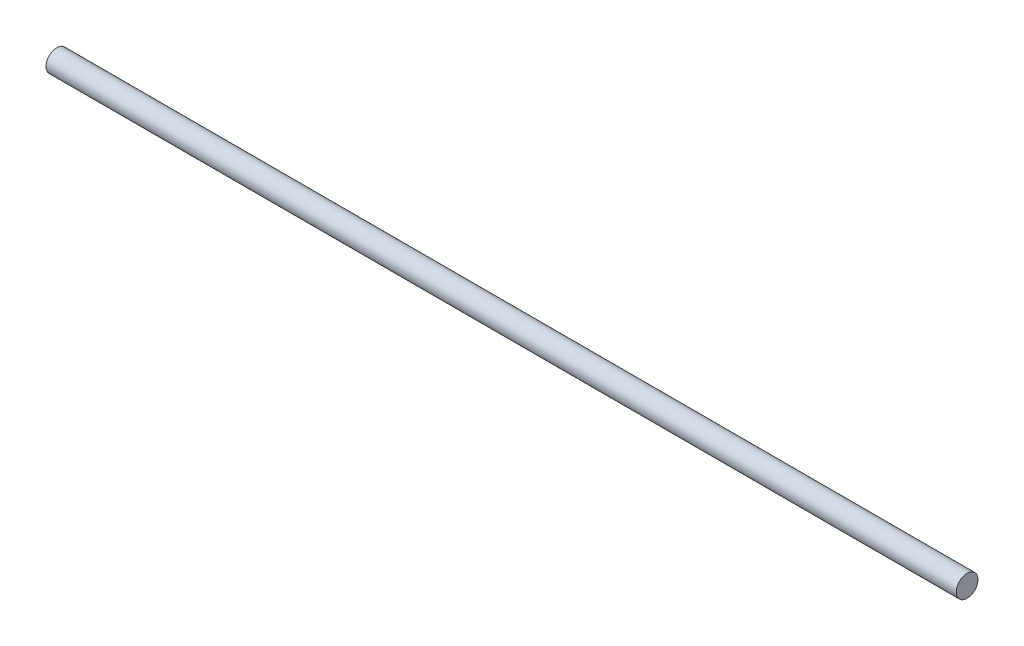
ISO-10303-21;
HEADER;
FILE_DESCRIPTION(('STEP AP214'),'2;1');
FILE_NAME('part.step','',(''),(''),'','','');
FILE_SCHEMA(('AUTOMOTIVE_DESIGN { 1 0 10303 214 1 1 1 1 }'));
ENDSEC;
DATA;
#1=APPLICATION_CONTEXT('core data for automotive mechanical design processes');
#2=APPLICATION_PROTOCOL_DEFINITION('international standard','automotive_design',2000,#1);
#3=PRODUCT_CONTEXT('',#1,'mechanical');
#4=PRODUCT('Part','Part','',(#3));
#5=PRODUCT_RELATED_PRODUCT_CATEGORY('part','',(#4));
#6=PRODUCT_DEFINITION_FORMATION('','',#4);
#7=PRODUCT_DEFINITION_CONTEXT('part definition',#1,'design');
#8=PRODUCT_DEFINITION('design','',#6,#7);
#9=PRODUCT_DEFINITION_SHAPE('','',#8);
#10=(LENGTH_UNIT() NAMED_UNIT(*) SI_UNIT(.MILLI.,.METRE.));
#11=(NAMED_UNIT(*) PLANE_ANGLE_UNIT() SI_UNIT($,.RADIAN.));
#12=(NAMED_UNIT(*) SI_UNIT($,.STERADIAN.) SOLID_ANGLE_UNIT());
#13=UNCERTAINTY_MEASURE_WITH_UNIT(LENGTH_MEASURE(1.E-05),#10,'distance_accuracy_value','');
#14=(GEOMETRIC_REPRESENTATION_CONTEXT(3) GLOBAL_UNCERTAINTY_ASSIGNED_CONTEXT((#13)) GLOBAL_UNIT_ASSIGNED_CONTEXT((#10,
#11,#12)) REPRESENTATION_CONTEXT('',''));
#15=CARTESIAN_POINT('',(0.,0.,0.));
#16=DIRECTION('',(0.,0.,1.));
#17=DIRECTION('',(1.,0.,0.));
#18=AXIS2_PLACEMENT_3D('',#15,#16,#17);
#19=CARTESIAN_POINT('',(167.5,0.,0.));
#20=DIRECTION('',(-1.,0.,0.));
#21=DIRECTION('',(0.,0.,1.));
#22=AXIS2_PLACEMENT_3D('',#19,#20,#21);
#23=CYLINDRICAL_SURFACE('',#22,4.);
#24=CARTESIAN_POINT('',(167.5,0.,0.));
#25=DIRECTION('',(1.,0.,0.));
#26=DIRECTION('',(0.,0.,-1.));
#27=AXIS2_PLACEMENT_3D('',#24,#25,#26);
#28=CIRCLE('',#27,4.);
#29=CARTESIAN_POINT('',(167.5,0.,-4.));
#30=VERTEX_POINT('',#29);
#31=EDGE_CURVE('E10',#30,#30,#28,.T.);
#32=ORIENTED_EDGE('',*,*,#31,.F.);
#33=EDGE_LOOP('',(#32));
#34=FACE_BOUND('',#33,.T.);
#35=CARTESIAN_POINT('',(-167.5,0.,0.));
#36=DIRECTION('',(1.,0.,0.));
#37=DIRECTION('',(0.,0.,-1.));
#38=AXIS2_PLACEMENT_3D('',#35,#36,#37);
#39=CIRCLE('',#38,4.);
#40=CARTESIAN_POINT('',(-167.5,0.,-4.));
#41=VERTEX_POINT('',#40);
#42=EDGE_CURVE('E34',#41,#41,#39,.T.);
#43=ORIENTED_EDGE('',*,*,#42,.T.);
#44=EDGE_LOOP('',(#43));
#45=FACE_BOUND('',#44,.T.);
#46=ADVANCED_FACE('F31',(#34,#45),#23,.T.);
#47=CARTESIAN_POINT('',(167.5,0.,0.));
#48=DIRECTION('',(1.,0.,0.));
#49=DIRECTION('',(0.,0.,-1.));
#50=AXIS2_PLACEMENT_3D('',#47,#48,#49);
#51=PLANE('',#50);
#52=ORIENTED_EDGE('',*,*,#31,.T.);
#53=EDGE_LOOP('',(#52));
#54=FACE_BOUND('',#53,.T.);
#55=ADVANCED_FACE('F46',(#54),#51,.T.);
#56=CARTESIAN_POINT('',(-167.5,0.,0.));
#57=DIRECTION('',(1.,0.,0.));
#58=DIRECTION('',(0.,0.,-1.));
#59=AXIS2_PLACEMENT_3D('',#56,#57,#58);
#60=PLANE('',#59);
#61=ORIENTED_EDGE('',*,*,#42,.F.);
#62=EDGE_LOOP('',(#61));
#63=FACE_BOUND('',#62,.T.);
#64=ADVANCED_FACE('F44',(#63),#60,.F.);
#65=CLOSED_SHELL('',(#46,#55,#64));
#66=MANIFOLD_SOLID_BREP('B2',#65);
#67=ADVANCED_BREP_SHAPE_REPRESENTATION('',(#18,#66),#14);
#68=SHAPE_DEFINITION_REPRESENTATION(#9,#67);
ENDSEC;
END-ISO-10303-21;
